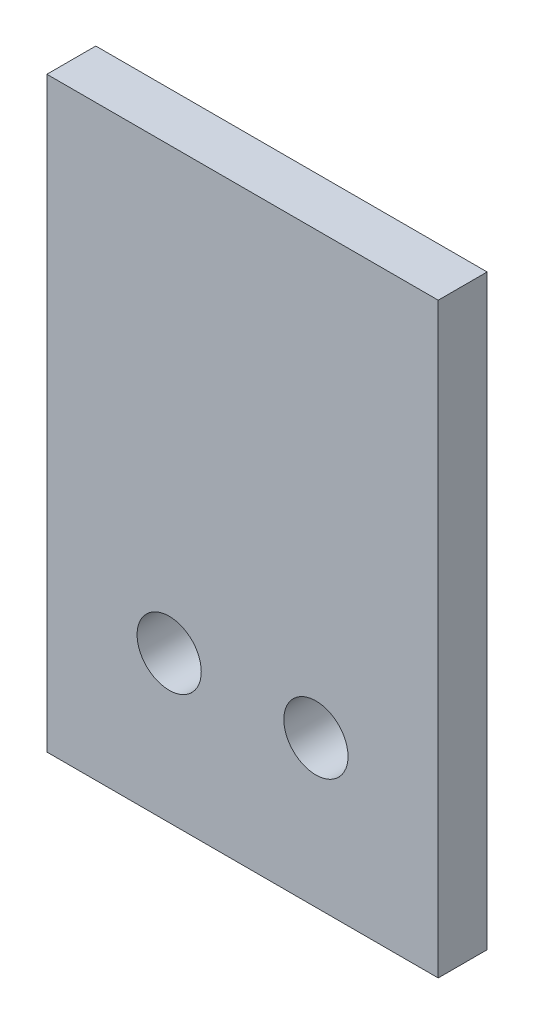
ISO-10303-21;
HEADER;
FILE_DESCRIPTION(('STEP AP214'),'2;1');
FILE_NAME('part.step','',(''),(''),'','','');
FILE_SCHEMA(('AUTOMOTIVE_DESIGN { 1 0 10303 214 1 1 1 1 }'));
ENDSEC;
DATA;
#1=APPLICATION_CONTEXT('core data for automotive mechanical design processes');
#2=APPLICATION_PROTOCOL_DEFINITION('international standard','automotive_design',2000,#1);
#3=PRODUCT_CONTEXT('',#1,'mechanical');
#4=PRODUCT('Part','Part','',(#3));
#5=PRODUCT_RELATED_PRODUCT_CATEGORY('part','',(#4));
#6=PRODUCT_DEFINITION_FORMATION('','',#4);
#7=PRODUCT_DEFINITION_CONTEXT('part definition',#1,'design');
#8=PRODUCT_DEFINITION('design','',#6,#7);
#9=PRODUCT_DEFINITION_SHAPE('','',#8);
#10=(LENGTH_UNIT() NAMED_UNIT(*) SI_UNIT(.MILLI.,.METRE.));
#11=(NAMED_UNIT(*) PLANE_ANGLE_UNIT() SI_UNIT($,.RADIAN.));
#12=(NAMED_UNIT(*) SI_UNIT($,.STERADIAN.) SOLID_ANGLE_UNIT());
#13=UNCERTAINTY_MEASURE_WITH_UNIT(LENGTH_MEASURE(1.E-05),#10,'distance_accuracy_value','');
#14=(GEOMETRIC_REPRESENTATION_CONTEXT(3) GLOBAL_UNCERTAINTY_ASSIGNED_CONTEXT((#13)) GLOBAL_UNIT_ASSIGNED_CONTEXT((#10,
#11,#12)) REPRESENTATION_CONTEXT('',''));
#15=CARTESIAN_POINT('',(0.,0.,0.));
#16=DIRECTION('',(0.,0.,1.));
#17=DIRECTION('',(1.,0.,0.));
#18=AXIS2_PLACEMENT_3D('',#15,#16,#17);
#19=CARTESIAN_POINT('',(0.,0.,6.35));
#20=DIRECTION('',(0.,0.,1.));
#21=DIRECTION('',(1.,0.,0.));
#22=AXIS2_PLACEMENT_3D('',#19,#20,#21);
#23=PLANE('',#22);
#24=CARTESIAN_POINT('',(-9.525,19.05,6.35));
#25=DIRECTION('',(0.,0.,1.));
#26=DIRECTION('',(1.,0.,0.));
#27=AXIS2_PLACEMENT_3D('',#24,#25,#26);
#28=CIRCLE('',#27,4.1656);
#29=CARTESIAN_POINT('',(-5.3594,19.05,6.35));
#30=VERTEX_POINT('',#29);
#31=EDGE_CURVE('E106',#30,#30,#28,.T.);
#32=ORIENTED_EDGE('',*,*,#31,.F.);
#33=EDGE_LOOP('',(#32));
#34=FACE_BOUND('',#33,.T.);
#35=DIRECTION('',(0.,1.,0.));
#36=VECTOR('',#35,1.);
#37=CARTESIAN_POINT('',(25.4,76.2,6.35));
#38=LINE('',#37,#36);
#39=CARTESIAN_POINT('',(25.4,0.,6.35));
#40=VERTEX_POINT('',#39);
#41=CARTESIAN_POINT('',(25.4,76.2,6.35));
#42=VERTEX_POINT('',#41);
#43=EDGE_CURVE('E91',#40,#42,#38,.T.);
#44=ORIENTED_EDGE('',*,*,#43,.T.);
#45=DIRECTION('',(-1.,0.,0.));
#46=VECTOR('',#45,1.);
#47=CARTESIAN_POINT('',(-25.4,76.2,6.35));
#48=LINE('',#47,#46);
#49=CARTESIAN_POINT('',(-25.4,76.2,6.35));
#50=VERTEX_POINT('',#49);
#51=EDGE_CURVE('E86',#42,#50,#48,.T.);
#52=ORIENTED_EDGE('',*,*,#51,.T.);
#53=DIRECTION('',(0.,-1.,0.));
#54=VECTOR('',#53,1.);
#55=CARTESIAN_POINT('',(-25.4,76.2,6.35));
#56=LINE('',#55,#54);
#57=CARTESIAN_POINT('',(-25.4,0.,6.35));
#58=VERTEX_POINT('',#57);
#59=EDGE_CURVE('E89',#50,#58,#56,.T.);
#60=ORIENTED_EDGE('',*,*,#59,.T.);
#61=DIRECTION('',(1.,0.,0.));
#62=VECTOR('',#61,1.);
#63=CARTESIAN_POINT('',(-25.4,0.,6.35));
#64=LINE('',#63,#62);
#65=EDGE_CURVE('E56',#58,#40,#64,.T.);
#66=ORIENTED_EDGE('',*,*,#65,.T.);
#67=EDGE_LOOP('',(#44,#52,#60,#66));
#68=FACE_BOUND('',#67,.T.);
#69=CARTESIAN_POINT('',(9.525,19.05,6.35));
#70=DIRECTION('',(0.,0.,1.));
#71=DIRECTION('',(1.,0.,0.));
#72=AXIS2_PLACEMENT_3D('',#69,#70,#71);
#73=CIRCLE('',#72,4.1656);
#74=CARTESIAN_POINT('',(13.6906,19.05,6.35));
#75=VERTEX_POINT('',#74);
#76=EDGE_CURVE('E121',#75,#75,#73,.T.);
#77=ORIENTED_EDGE('',*,*,#76,.F.);
#78=EDGE_LOOP('',(#77));
#79=FACE_BOUND('',#78,.T.);
#80=ADVANCED_FACE('F39',(#34,#68,#79),#23,.T.);
#81=CARTESIAN_POINT('',(0.,0.,0.));
#82=DIRECTION('',(0.,0.,1.));
#83=DIRECTION('',(1.,0.,0.));
#84=AXIS2_PLACEMENT_3D('',#81,#82,#83);
#85=PLANE('',#84);
#86=DIRECTION('',(0.,1.,0.));
#87=VECTOR('',#86,1.);
#88=CARTESIAN_POINT('',(25.4,76.2,0.));
#89=LINE('',#88,#87);
#90=CARTESIAN_POINT('',(25.4,0.,0.));
#91=VERTEX_POINT('',#90);
#92=CARTESIAN_POINT('',(25.4,76.2,0.));
#93=VERTEX_POINT('',#92);
#94=EDGE_CURVE('E103',#91,#93,#89,.T.);
#95=ORIENTED_EDGE('',*,*,#94,.F.);
#96=DIRECTION('',(1.,0.,0.));
#97=VECTOR('',#96,1.);
#98=CARTESIAN_POINT('',(-25.4,0.,0.));
#99=LINE('',#98,#97);
#100=CARTESIAN_POINT('',(-25.4,0.,0.));
#101=VERTEX_POINT('',#100);
#102=EDGE_CURVE('E79',#101,#91,#99,.T.);
#103=ORIENTED_EDGE('',*,*,#102,.F.);
#104=DIRECTION('',(0.,-1.,0.));
#105=VECTOR('',#104,1.);
#106=CARTESIAN_POINT('',(-25.4,76.2,0.));
#107=LINE('',#106,#105);
#108=CARTESIAN_POINT('',(-25.4,76.2,0.));
#109=VERTEX_POINT('',#108);
#110=EDGE_CURVE('E73',#109,#101,#107,.T.);
#111=ORIENTED_EDGE('',*,*,#110,.F.);
#112=DIRECTION('',(-1.,0.,0.));
#113=VECTOR('',#112,1.);
#114=CARTESIAN_POINT('',(-25.4,76.2,0.));
#115=LINE('',#114,#113);
#116=EDGE_CURVE('E95',#93,#109,#115,.T.);
#117=ORIENTED_EDGE('',*,*,#116,.F.);
#118=EDGE_LOOP('',(#95,#103,#111,#117));
#119=FACE_BOUND('',#118,.T.);
#120=CARTESIAN_POINT('',(-9.525,19.05,0.));
#121=DIRECTION('',(0.,0.,1.));
#122=DIRECTION('',(1.,0.,0.));
#123=AXIS2_PLACEMENT_3D('',#120,#121,#122);
#124=CIRCLE('',#123,4.1656);
#125=CARTESIAN_POINT('',(-5.3594,19.05,0.));
#126=VERTEX_POINT('',#125);
#127=EDGE_CURVE('E118',#126,#126,#124,.T.);
#128=ORIENTED_EDGE('',*,*,#127,.T.);
#129=EDGE_LOOP('',(#128));
#130=FACE_BOUND('',#129,.T.);
#131=CARTESIAN_POINT('',(9.525,19.05,0.));
#132=DIRECTION('',(0.,0.,1.));
#133=DIRECTION('',(1.,0.,0.));
#134=AXIS2_PLACEMENT_3D('',#131,#132,#133);
#135=CIRCLE('',#134,4.1656);
#136=CARTESIAN_POINT('',(13.6906,19.05,0.));
#137=VERTEX_POINT('',#136);
#138=EDGE_CURVE('E124',#137,#137,#135,.T.);
#139=ORIENTED_EDGE('',*,*,#138,.T.);
#140=EDGE_LOOP('',(#139));
#141=FACE_BOUND('',#140,.T.);
#142=ADVANCED_FACE('F114',(#119,#130,#141),#85,.F.);
#143=CARTESIAN_POINT('',(25.4,76.2,6.35));
#144=DIRECTION('',(-1.,0.,0.));
#145=DIRECTION('',(0.,-1.,0.));
#146=AXIS2_PLACEMENT_3D('',#143,#144,#145);
#147=PLANE('',#146);
#148=ORIENTED_EDGE('',*,*,#94,.T.);
#149=DIRECTION('',(0.,0.,-1.));
#150=VECTOR('',#149,1.);
#151=CARTESIAN_POINT('',(25.4,76.2,6.35));
#152=LINE('',#151,#150);
#153=EDGE_CURVE('E11',#42,#93,#152,.T.);
#154=ORIENTED_EDGE('',*,*,#153,.F.);
#155=ORIENTED_EDGE('',*,*,#43,.F.);
#156=DIRECTION('',(0.,0.,-1.));
#157=VECTOR('',#156,1.);
#158=CARTESIAN_POINT('',(25.4,0.,6.35));
#159=LINE('',#158,#157);
#160=EDGE_CURVE('E99',#40,#91,#159,.T.);
#161=ORIENTED_EDGE('',*,*,#160,.T.);
#162=EDGE_LOOP('',(#148,#154,#155,#161));
#163=FACE_BOUND('',#162,.T.);
#164=ADVANCED_FACE('F41',(#163),#147,.F.);
#165=CARTESIAN_POINT('',(-25.4,76.2,6.35));
#166=DIRECTION('',(0.,-1.,0.));
#167=DIRECTION('',(0.,0.,-1.));
#168=AXIS2_PLACEMENT_3D('',#165,#166,#167);
#169=PLANE('',#168);
#170=ORIENTED_EDGE('',*,*,#116,.T.);
#171=DIRECTION('',(0.,0.,-1.));
#172=VECTOR('',#171,1.);
#173=CARTESIAN_POINT('',(-25.4,76.2,6.35));
#174=LINE('',#173,#172);
#175=EDGE_CURVE('E48',#50,#109,#174,.T.);
#176=ORIENTED_EDGE('',*,*,#175,.F.);
#177=ORIENTED_EDGE('',*,*,#51,.F.);
#178=ORIENTED_EDGE('',*,*,#153,.T.);
#179=EDGE_LOOP('',(#170,#176,#177,#178));
#180=FACE_BOUND('',#179,.T.);
#181=ADVANCED_FACE('F94',(#180),#169,.F.);
#182=CARTESIAN_POINT('',(-25.4,76.2,6.35));
#183=DIRECTION('',(1.,0.,0.));
#184=DIRECTION('',(0.,1.,0.));
#185=AXIS2_PLACEMENT_3D('',#182,#183,#184);
#186=PLANE('',#185);
#187=ORIENTED_EDGE('',*,*,#110,.T.);
#188=DIRECTION('',(0.,0.,-1.));
#189=VECTOR('',#188,1.);
#190=CARTESIAN_POINT('',(-25.4,0.,6.35));
#191=LINE('',#190,#189);
#192=EDGE_CURVE('E96',#58,#101,#191,.T.);
#193=ORIENTED_EDGE('',*,*,#192,.F.);
#194=ORIENTED_EDGE('',*,*,#59,.F.);
#195=ORIENTED_EDGE('',*,*,#175,.T.);
#196=EDGE_LOOP('',(#187,#193,#194,#195));
#197=FACE_BOUND('',#196,.T.);
#198=ADVANCED_FACE('F97',(#197),#186,.F.);
#199=CARTESIAN_POINT('',(-25.4,0.,6.35));
#200=DIRECTION('',(0.,1.,0.));
#201=DIRECTION('',(0.,0.,1.));
#202=AXIS2_PLACEMENT_3D('',#199,#200,#201);
#203=PLANE('',#202);
#204=ORIENTED_EDGE('',*,*,#102,.T.);
#205=ORIENTED_EDGE('',*,*,#160,.F.);
#206=ORIENTED_EDGE('',*,*,#65,.F.);
#207=ORIENTED_EDGE('',*,*,#192,.T.);
#208=EDGE_LOOP('',(#204,#205,#206,#207));
#209=FACE_BOUND('',#208,.T.);
#210=ADVANCED_FACE('F111',(#209),#203,.F.);
#211=CARTESIAN_POINT('',(-9.525,19.05,6.35));
#212=DIRECTION('',(0.,0.,-1.));
#213=DIRECTION('',(-1.,0.,0.));
#214=AXIS2_PLACEMENT_3D('',#211,#212,#213);
#215=CYLINDRICAL_SURFACE('',#214,4.1656);
#216=ORIENTED_EDGE('',*,*,#31,.T.);
#217=EDGE_LOOP('',(#216));
#218=FACE_BOUND('',#217,.T.);
#219=ORIENTED_EDGE('',*,*,#127,.F.);
#220=EDGE_LOOP('',(#219));
#221=FACE_BOUND('',#220,.T.);
#222=ADVANCED_FACE('F141',(#218,#221),#215,.F.);
#223=CARTESIAN_POINT('',(9.525,19.05,6.35));
#224=DIRECTION('',(0.,0.,-1.));
#225=DIRECTION('',(-1.,0.,0.));
#226=AXIS2_PLACEMENT_3D('',#223,#224,#225);
#227=CYLINDRICAL_SURFACE('',#226,4.1656);
#228=ORIENTED_EDGE('',*,*,#76,.T.);
#229=EDGE_LOOP('',(#228));
#230=FACE_BOUND('',#229,.T.);
#231=ORIENTED_EDGE('',*,*,#138,.F.);
#232=EDGE_LOOP('',(#231));
#233=FACE_BOUND('',#232,.T.);
#234=ADVANCED_FACE('F130',(#230,#233),#227,.F.);
#235=CLOSED_SHELL('',(#80,#142,#164,#181,#198,#210,#222,#234));
#236=MANIFOLD_SOLID_BREP('B2',#235);
#237=ADVANCED_BREP_SHAPE_REPRESENTATION('',(#18,#236),#14);
#238=SHAPE_DEFINITION_REPRESENTATION(#9,#237);
ENDSEC;
END-ISO-10303-21;
